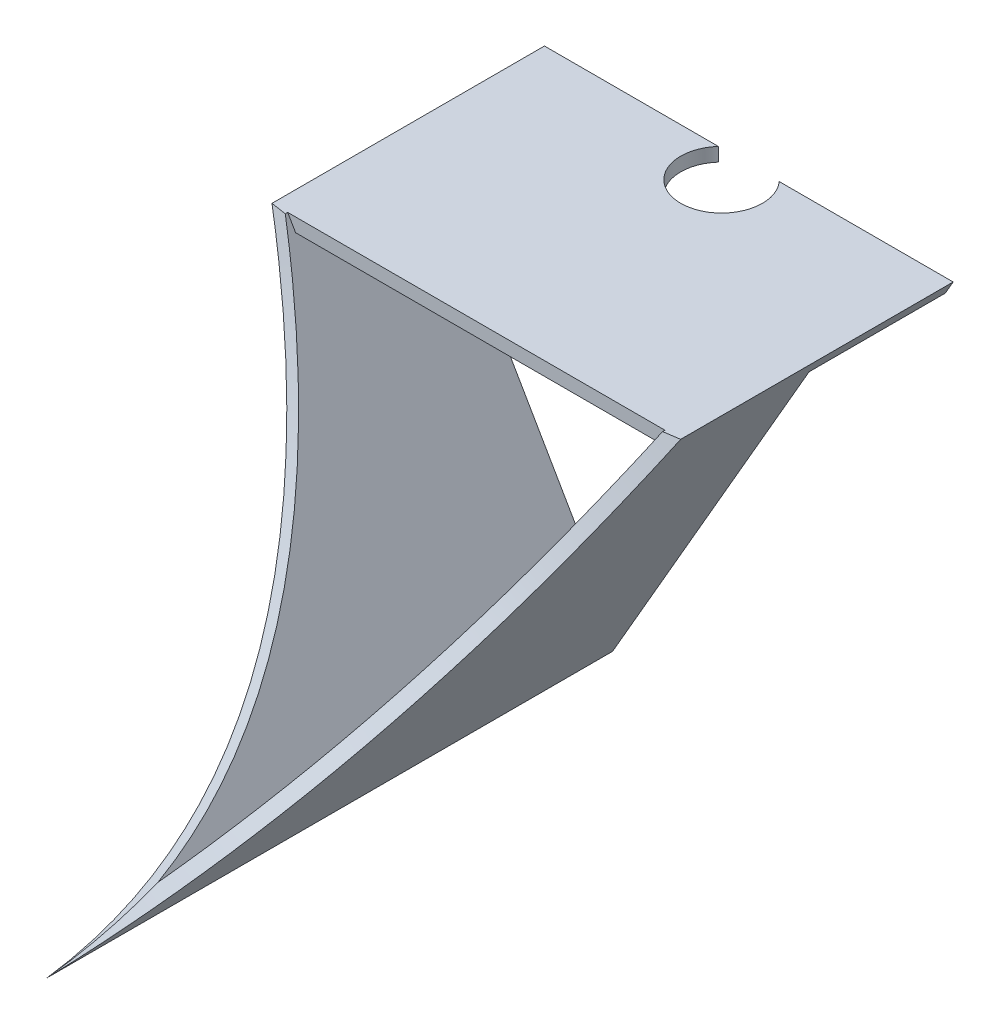
ISO-10303-21;
HEADER;
FILE_DESCRIPTION(('STEP AP214'),'2;1');
FILE_NAME('part.step','',(''),(''),'','','');
FILE_SCHEMA(('AUTOMOTIVE_DESIGN { 1 0 10303 214 1 1 1 1 }'));
ENDSEC;
DATA;
#1=APPLICATION_CONTEXT('core data for automotive mechanical design processes');
#2=APPLICATION_PROTOCOL_DEFINITION('international standard','automotive_design',2000,#1);
#3=PRODUCT_CONTEXT('',#1,'mechanical');
#4=PRODUCT('Part','Part','',(#3));
#5=PRODUCT_RELATED_PRODUCT_CATEGORY('part','',(#4));
#6=PRODUCT_DEFINITION_FORMATION('','',#4);
#7=PRODUCT_DEFINITION_CONTEXT('part definition',#1,'design');
#8=PRODUCT_DEFINITION('design','',#6,#7);
#9=PRODUCT_DEFINITION_SHAPE('','',#8);
#10=(LENGTH_UNIT() NAMED_UNIT(*) SI_UNIT(.MILLI.,.METRE.));
#11=(NAMED_UNIT(*) PLANE_ANGLE_UNIT() SI_UNIT($,.RADIAN.));
#12=(NAMED_UNIT(*) SI_UNIT($,.STERADIAN.) SOLID_ANGLE_UNIT());
#13=UNCERTAINTY_MEASURE_WITH_UNIT(LENGTH_MEASURE(1.E-05),#10,'distance_accuracy_value','');
#14=(GEOMETRIC_REPRESENTATION_CONTEXT(3) GLOBAL_UNCERTAINTY_ASSIGNED_CONTEXT((#13)) GLOBAL_UNIT_ASSIGNED_CONTEXT((#10,
#11,#12)) REPRESENTATION_CONTEXT('',''));
#15=CARTESIAN_POINT('',(0.,0.,0.));
#16=DIRECTION('',(0.,0.,1.));
#17=DIRECTION('',(1.,0.,0.));
#18=AXIS2_PLACEMENT_3D('',#15,#16,#17);
#19=CARTESIAN_POINT('',(0.,0.,0.));
#20=DIRECTION('',(0.,0.,-1.));
#21=DIRECTION('',(-1.,0.,0.));
#22=AXIS2_PLACEMENT_3D('',#19,#20,#21);
#23=PLANE('',#22);
#24=DIRECTION('',(0.,1.,0.));
#25=VECTOR('',#24,1.);
#26=CARTESIAN_POINT('',(-2.23606797749979,0.,0.));
#27=LINE('',#26,#25);
#28=CARTESIAN_POINT('',(-2.23606797749979,0.,0.));
#29=VERTEX_POINT('',#28);
#30=CARTESIAN_POINT('',(-2.23606797749979,1.,0.));
#31=VERTEX_POINT('',#30);
#32=EDGE_CURVE('E11',#29,#31,#27,.T.);
#33=ORIENTED_EDGE('',*,*,#32,.F.);
#34=DIRECTION('',(-1.,0.,0.));
#35=VECTOR('',#34,1.);
#36=CARTESIAN_POINT('',(-13.2679491924311,0.,0.));
#37=LINE('',#36,#35);
#38=CARTESIAN_POINT('',(-14.4226497308104,0.,0.));
#39=VERTEX_POINT('',#38);
#40=EDGE_CURVE('E173',#29,#39,#37,.T.);
#41=ORIENTED_EDGE('',*,*,#40,.T.);
#42=DIRECTION('',(0.500000000000004,-0.866025403784436,0.));
#43=VECTOR('',#42,1.);
#44=CARTESIAN_POINT('',(-15.,1.,0.));
#45=LINE('',#44,#43);
#46=CARTESIAN_POINT('',(-15.,1.,0.));
#47=VERTEX_POINT('',#46);
#48=EDGE_CURVE('E144',#47,#39,#45,.T.);
#49=ORIENTED_EDGE('',*,*,#48,.F.);
#50=DIRECTION('',(-1.,0.,0.));
#51=VECTOR('',#50,1.);
#52=CARTESIAN_POINT('',(-15.,1.,0.));
#53=LINE('',#52,#51);
#54=EDGE_CURVE('E135',#31,#47,#53,.T.);
#55=ORIENTED_EDGE('',*,*,#54,.F.);
#56=EDGE_LOOP('',(#33,#41,#49,#55));
#57=FACE_BOUND('',#56,.T.);
#58=ADVANCED_FACE('F38',(#57),#23,.T.);
#59=CARTESIAN_POINT('',(-13.2679491924311,0.,60.));
#60=DIRECTION('',(0.,-1.,0.));
#61=DIRECTION('',(0.,0.,-1.));
#62=AXIS2_PLACEMENT_3D('',#59,#60,#61);
#63=PLANE('',#62);
#64=CARTESIAN_POINT('',(0.,0.,2.));
#65=DIRECTION('',(0.,1.,0.));
#66=DIRECTION('',(-1.,0.,0.));
#67=AXIS2_PLACEMENT_3D('',#64,#65,#66);
#68=CIRCLE('',#67,3.);
#69=CARTESIAN_POINT('',(2.23606797749979,0.,0.));
#70=VERTEX_POINT('',#69);
#71=EDGE_CURVE('E127',#29,#70,#68,.T.);
#72=ORIENTED_EDGE('',*,*,#71,.T.);
#73=CARTESIAN_POINT('',(14.4226497308104,0.,0.));
#74=VERTEX_POINT('',#73);
#75=EDGE_CURVE('E170',#74,#70,#37,.T.);
#76=ORIENTED_EDGE('',*,*,#75,.F.);
#77=DIRECTION('',(0.,0.,-1.));
#78=VECTOR('',#77,1.);
#79=CARTESIAN_POINT('',(14.4226497308104,0.,60.));
#80=LINE('',#79,#78);
#81=CARTESIAN_POINT('',(14.4226497308104,0.,10.));
#82=VERTEX_POINT('',#81);
#83=EDGE_CURVE('E294',#82,#74,#80,.T.);
#84=ORIENTED_EDGE('',*,*,#83,.F.);
#85=DIRECTION('',(1.,0.,0.));
#86=VECTOR('',#85,1.);
#87=CARTESIAN_POINT('',(15.8721667836003,0.,10.));
#88=LINE('',#87,#86);
#89=CARTESIAN_POINT('',(13.2679491924311,0.,10.));
#90=VERTEX_POINT('',#89);
#91=EDGE_CURVE('E175',#90,#82,#88,.T.);
#92=ORIENTED_EDGE('',*,*,#91,.F.);
#93=DIRECTION('',(0.,0.,-1.));
#94=VECTOR('',#93,1.);
#95=CARTESIAN_POINT('',(13.2679491924311,0.,60.));
#96=LINE('',#95,#94);
#97=CARTESIAN_POINT('',(13.2679491972894,8.41483458434433E-09,20.));
#98=VERTEX_POINT('',#97);
#99=EDGE_CURVE('E200',#98,#90,#96,.T.);
#100=ORIENTED_EDGE('',*,*,#99,.F.);
#101=DIRECTION('',(1.,3.17111367191734E-10,0.));
#102=VECTOR('',#101,1.);
#103=CARTESIAN_POINT('',(13.2679491972894,8.41483458434433E-09,20.));
#104=LINE('',#103,#102);
#105=CARTESIAN_POINT('',(-13.2679491924311,0.,20.));
#106=VERTEX_POINT('',#105);
#107=EDGE_CURVE('E285',#106,#98,#104,.T.);
#108=ORIENTED_EDGE('',*,*,#107,.F.);
#109=DIRECTION('',(0.,0.,-1.));
#110=VECTOR('',#109,1.);
#111=CARTESIAN_POINT('',(-13.2679491924311,0.,60.));
#112=LINE('',#111,#110);
#113=CARTESIAN_POINT('',(-13.2679491924311,0.,10.));
#114=VERTEX_POINT('',#113);
#115=EDGE_CURVE('E185',#106,#114,#112,.T.);
#116=ORIENTED_EDGE('',*,*,#115,.T.);
#117=CARTESIAN_POINT('',(-14.4226497308104,0.,10.));
#118=VERTEX_POINT('',#117);
#119=EDGE_CURVE('E306',#118,#114,#88,.T.);
#120=ORIENTED_EDGE('',*,*,#119,.F.);
#121=DIRECTION('',(0.,0.,1.));
#122=VECTOR('',#121,1.);
#123=CARTESIAN_POINT('',(-14.4226497308104,0.,60.));
#124=LINE('',#123,#122);
#125=EDGE_CURVE('E207',#39,#118,#124,.T.);
#126=ORIENTED_EDGE('',*,*,#125,.F.);
#127=ORIENTED_EDGE('',*,*,#40,.F.);
#128=EDGE_LOOP('',(#72,#76,#84,#92,#100,#108,#116,#120,#126,#127));
#129=FACE_BOUND('',#128,.T.);
#130=ADVANCED_FACE('F169',(#129),#63,.T.);
#131=CARTESIAN_POINT('',(-15.,1.,60.));
#132=DIRECTION('',(0.866025403784436,0.500000000000004,0.));
#133=DIRECTION('',(-0.500000000000004,0.866025403784436,0.));
#134=AXIS2_PLACEMENT_3D('',#131,#132,#133);
#135=PLANE('',#134);
#136=ORIENTED_EDGE('',*,*,#48,.T.);
#137=ORIENTED_EDGE('',*,*,#125,.T.);
#138=DIRECTION('',(0.500000000000004,-0.866025403784436,0.));
#139=VECTOR('',#138,1.);
#140=CARTESIAN_POINT('',(-15.,1.,10.));
#141=LINE('',#140,#139);
#142=CARTESIAN_POINT('',(0.,-24.9807621135329,10.));
#143=VERTEX_POINT('',#142);
#144=EDGE_CURVE('E297',#118,#143,#141,.T.);
#145=ORIENTED_EDGE('',*,*,#144,.T.);
#146=DIRECTION('',(0.,0.,-1.));
#147=VECTOR('',#146,1.);
#148=CARTESIAN_POINT('',(0.,-24.9807621135329,60.));
#149=LINE('',#148,#147);
#150=CARTESIAN_POINT('',(0.,-24.9807621135329,51.5266934957561));
#151=VERTEX_POINT('',#150);
#152=EDGE_CURVE('E159',#151,#143,#149,.T.);
#153=ORIENTED_EDGE('',*,*,#152,.F.);
#154=CARTESIAN_POINT('',(0.,-24.9807621135329,60.));
#155=CARTESIAN_POINT('',(1.30334503884656,-27.2382219406079,29.8865382210596));
#156=CARTESIAN_POINT('',(-15.,1.,20.));
#157=B_SPLINE_CURVE_WITH_KNOTS('',2,(#154,#155,#156),.UNSPECIFIED.,.F.,.F.,(3,3),(0.,1.),.UNSPECIFIED.);
#158=CARTESIAN_POINT('',(-15.,1.,20.));
#159=VERTEX_POINT('',#158);
#160=EDGE_CURVE('E210',#151,#159,#157,.T.);
#161=ORIENTED_EDGE('',*,*,#160,.T.);
#162=DIRECTION('',(0.,0.,-1.));
#163=VECTOR('',#162,1.);
#164=CARTESIAN_POINT('',(-15.,1.,60.));
#165=LINE('',#164,#163);
#166=EDGE_CURVE('E150',#159,#47,#165,.T.);
#167=ORIENTED_EDGE('',*,*,#166,.T.);
#168=EDGE_LOOP('',(#136,#137,#145,#153,#161,#167));
#169=FACE_BOUND('',#168,.T.);
#170=ADVANCED_FACE('F40',(#169),#135,.F.);
#171=CARTESIAN_POINT('',(-15.,1.,60.));
#172=DIRECTION('',(0.,-1.,0.));
#173=DIRECTION('',(1.,0.,0.));
#174=AXIS2_PLACEMENT_3D('',#171,#172,#173);
#175=PLANE('',#174);
#176=CARTESIAN_POINT('',(15.,0.999999999999999,0.));
#177=VERTEX_POINT('',#176);
#178=CARTESIAN_POINT('',(2.23606797749979,1.,0.));
#179=VERTEX_POINT('',#178);
#180=EDGE_CURVE('E139',#177,#179,#53,.T.);
#181=ORIENTED_EDGE('',*,*,#180,.T.);
#182=CARTESIAN_POINT('',(0.,1.,2.));
#183=DIRECTION('',(0.,1.,0.));
#184=DIRECTION('',(-1.,0.,0.));
#185=AXIS2_PLACEMENT_3D('',#182,#183,#184);
#186=CIRCLE('',#185,3.);
#187=EDGE_CURVE('E53',#31,#179,#186,.T.);
#188=ORIENTED_EDGE('',*,*,#187,.F.);
#189=ORIENTED_EDGE('',*,*,#54,.T.);
#190=ORIENTED_EDGE('',*,*,#166,.F.);
#191=CARTESIAN_POINT('',(-13.8452994643103,1.00000000232923,20.1775016422521));
#192=CARTESIAN_POINT('',(-14.037688046205,1.00000000116461,20.147517911517));
#193=CARTESIAN_POINT('',(-14.2301073817931,1.0000000003882,20.1177342426284));
#194=CARTESIAN_POINT('',(-14.6150075603564,0.999999999611796,20.0585670285444));
#195=CARTESIAN_POINT('',(-14.8074884033315,0.999999999611797,20.0291834833489));
#196=CARTESIAN_POINT('',(-15.,1.,20.));
#197=B_SPLINE_CURVE_WITH_KNOTS('',3,(#191,#192,#193,#194,#195,#196),.UNSPECIFIED.,.F.,.F.,(4,2,
4),(0.,0.584132184326329,1.16826436865266),.UNSPECIFIED.);
#198=CARTESIAN_POINT('',(-13.8452994586593,0.999999994870652,20.1775016457751));
#199=VERTEX_POINT('',#198);
#200=EDGE_CURVE('E213',#199,#159,#197,.T.);
#201=ORIENTED_EDGE('',*,*,#200,.F.);
#202=DIRECTION('',(0.,0.,1.));
#203=VECTOR('',#202,1.);
#204=CARTESIAN_POINT('',(-13.8452994586593,0.999999994870652,20.));
#205=LINE('',#204,#203);
#206=CARTESIAN_POINT('',(-13.8452994586593,0.999999994870652,20.));
#207=VERTEX_POINT('',#206);
#208=EDGE_CURVE('E215',#207,#199,#205,.T.);
#209=ORIENTED_EDGE('',*,*,#208,.F.);
#210=DIRECTION('',(-1.,-1.85237866554277E-10,0.));
#211=VECTOR('',#210,1.);
#212=CARTESIAN_POINT('',(-13.8452994586593,0.999999994870652,20.));
#213=LINE('',#212,#211);
#214=CARTESIAN_POINT('',(13.8452994616207,1.,20.));
#215=VERTEX_POINT('',#214);
#216=EDGE_CURVE('E276',#215,#207,#213,.T.);
#217=ORIENTED_EDGE('',*,*,#216,.F.);
#218=DIRECTION('',(0.,0.,1.));
#219=VECTOR('',#218,1.);
#220=CARTESIAN_POINT('',(13.8452994616207,1.,20.));
#221=LINE('',#220,#219);
#222=CARTESIAN_POINT('',(13.8452994616207,1.,20.1775016457751));
#223=VERTEX_POINT('',#222);
#224=EDGE_CURVE('E261',#215,#223,#221,.T.);
#225=ORIENTED_EDGE('',*,*,#224,.T.);
#226=CARTESIAN_POINT('',(13.8452994643103,1.00000000232923,20.1775016422521));
#227=CARTESIAN_POINT('',(14.037688046205,1.00000000116461,20.147517911517));
#228=CARTESIAN_POINT('',(14.2301073817931,1.0000000003882,20.1177342426284));
#229=CARTESIAN_POINT('',(14.6150075603564,0.999999999611796,20.0585670285444));
#230=CARTESIAN_POINT('',(14.8074884033315,0.999999999611798,20.0291834833489));
#231=CARTESIAN_POINT('',(15.,1.,20.));
#232=B_SPLINE_CURVE_WITH_KNOTS('',3,(#226,#227,#228,#229,#230,#231),.UNSPECIFIED.,.F.,.F.,(4,2,
4),(0.,0.584132184326331,1.16826436865266),.UNSPECIFIED.);
#233=CARTESIAN_POINT('',(15.,1.,20.));
#234=VERTEX_POINT('',#233);
#235=EDGE_CURVE('E187',#223,#234,#232,.T.);
#236=ORIENTED_EDGE('',*,*,#235,.T.);
#237=DIRECTION('',(0.,0.,-1.));
#238=VECTOR('',#237,1.);
#239=CARTESIAN_POINT('',(15.,0.999999999999999,60.));
#240=LINE('',#239,#238);
#241=EDGE_CURVE('E156',#234,#177,#240,.T.);
#242=ORIENTED_EDGE('',*,*,#241,.T.);
#243=EDGE_LOOP('',(#181,#188,#189,#190,#201,#209,#217,#225,#236,#242));
#244=FACE_BOUND('',#243,.T.);
#245=ADVANCED_FACE('F133',(#244),#175,.F.);
#246=CARTESIAN_POINT('',(-13.2679491924311,0.,60.));
#247=DIRECTION('',(0.866025403784436,0.500000000000004,0.));
#248=DIRECTION('',(-0.500000000000004,0.866025403784436,0.));
#249=AXIS2_PLACEMENT_3D('',#246,#247,#248);
#250=PLANE('',#249);
#251=DIRECTION('',(0.500000000000004,-0.866025403784436,0.));
#252=VECTOR('',#251,1.);
#253=CARTESIAN_POINT('',(-13.2679491924311,0.,10.));
#254=LINE('',#253,#252);
#255=CARTESIAN_POINT('',(0.,-22.9807621135329,10.));
#256=VERTEX_POINT('',#255);
#257=EDGE_CURVE('E61',#114,#256,#254,.T.);
#258=ORIENTED_EDGE('',*,*,#257,.F.);
#259=ORIENTED_EDGE('',*,*,#115,.F.);
#260=DIRECTION('',(0.500000000000005,-0.866025403784436,0.));
#261=VECTOR('',#260,1.);
#262=CARTESIAN_POINT('',(-13.2679491924311,0.,20.));
#263=LINE('',#262,#261);
#264=EDGE_CURVE('E289',#207,#106,#263,.T.);
#265=ORIENTED_EDGE('',*,*,#264,.F.);
#266=ORIENTED_EDGE('',*,*,#208,.T.);
#267=CARTESIAN_POINT('',(0.86602540378444,-24.4807621135329,60.));
#268=CARTESIAN_POINT('',(2.169370442631,-26.7382219406079,29.8865382210596));
#269=CARTESIAN_POINT('',(-14.1339745962156,1.5,20.));
#270=B_SPLINE_CURVE_WITH_KNOTS('',2,(#267,#268,#269),.UNSPECIFIED.,.F.,.F.,(3,3),(0.,1.),.UNSPECIFIED.);
#271=CARTESIAN_POINT('',(7.60806348476528E-12,-22.9807621135461,43.3767741457255));
#272=VERTEX_POINT('',#271);
#273=EDGE_CURVE('E226',#272,#199,#270,.T.);
#274=ORIENTED_EDGE('',*,*,#273,.F.);
#275=DIRECTION('',(0.,0.,-1.));
#276=VECTOR('',#275,1.);
#277=CARTESIAN_POINT('',(0.,-22.9807621135329,60.));
#278=LINE('',#277,#276);
#279=EDGE_CURVE('E180',#272,#256,#278,.T.);
#280=ORIENTED_EDGE('',*,*,#279,.T.);
#281=EDGE_LOOP('',(#258,#259,#265,#266,#274,#280));
#282=FACE_BOUND('',#281,.T.);
#283=ADVANCED_FACE('F314',(#282),#250,.T.);
#284=CARTESIAN_POINT('',(-0.86602540378444,-24.4807621135329,60.));
#285=CARTESIAN_POINT('',(-2.169370442631,-26.7382219406079,29.8865382210596));
#286=CARTESIAN_POINT('',(14.1339745962156,1.5,20.));
#287=B_SPLINE_CURVE_WITH_KNOTS('',2,(#284,#285,#286),.UNSPECIFIED.,.F.,.F.,(3,3),(0.,1.),.UNSPECIFIED.);
#288=DIRECTION('',(0.866025403784436,-0.500000000000004,0.));
#289=VECTOR('',#288,1.);
#290=SURFACE_OF_LINEAR_EXTRUSION('',#287,#289);
#291=CARTESIAN_POINT('',(0.,-24.9807621135329,51.5266934957563));
#292=CARTESIAN_POINT('',(0.,-24.9548568112254,51.2932857542788));
#293=CARTESIAN_POINT('',(0.,-24.9265948454539,51.060137278982));
#294=CARTESIAN_POINT('',(0.,-24.8653430323396,50.5950253020613));
#295=CARTESIAN_POINT('',(0.,-24.8323645609736,50.3630603014234));
#296=CARTESIAN_POINT('',(0.,-24.7616123036165,49.9003259772489));
#297=CARTESIAN_POINT('',(0.,-24.7238480204877,49.6695552026239));
#298=CARTESIAN_POINT('',(0.,-24.6434562605056,49.2092218247318));
#299=CARTESIAN_POINT('',(0.,-24.6008362350922,48.9796579210605));
#300=CARTESIAN_POINT('',(0.,-24.5106627546688,48.5217506366921));
#301=CARTESIAN_POINT('',(0.,-24.463114523207,48.2934062280607));
#302=CARTESIAN_POINT('',(0.,-24.3630124369588,47.8379506625689));
#303=CARTESIAN_POINT('',(0.,-24.3104614002332,47.6108388866961));
#304=CARTESIAN_POINT('',(0.,-24.2002644944753,47.157800614679));
#305=CARTESIAN_POINT('',(0.,-24.1426174946987,46.9318743934383));
#306=CARTESIAN_POINT('',(0.,-24.0221666525796,46.4812917797409));
#307=CARTESIAN_POINT('',(0.,-23.9593605113032,46.2566360015805));
#308=CARTESIAN_POINT('',(0.,-23.8285160425329,45.8086183056261));
#309=CARTESIAN_POINT('',(0.,-23.7604727421159,45.5852578396499));
#310=CARTESIAN_POINT('',(0.,-23.6190774753951,45.1398550904536));
#311=CARTESIAN_POINT('',(0.,-23.5457177165855,44.9178152802958));
#312=CARTESIAN_POINT('',(0.,-23.3936107201638,44.4750785762086));
#313=CARTESIAN_POINT('',(0.,-23.3148527347881,44.2543853735757));
#314=CARTESIAN_POINT('',(0.,-23.1518723603388,43.8143665697912));
#315=CARTESIAN_POINT('',(0.,-23.0676361566611,43.5950460859297));
#316=CARTESIAN_POINT('',(0.,-22.9807621135339,43.376774145684));
#317=B_SPLINE_CURVE_WITH_KNOTS('',3,(#291,#292,#293,#294,#295,#296,#297,#298,#299,#300,#301,
#302,#303,#304,#305,#306,#307,#308,#309,#310,#311,#312,#313,#314,#315,#316),.UNSPECIFIED.,.F.,
.F.,(4,2,2,2,2,2,2,2,2,2,2,2,4),(0.,0.704514151410825,1.4073568432882,2.10882519544079,
2.80923124245512,3.5089023569578,4.20818165554366,4.90761650870112,5.60736474133455,
6.30778581463949,7.00925513272043,7.71216408006146,8.41692000547265),.UNSPECIFIED.);
#318=EDGE_CURVE('E220',#151,#272,#317,.T.);
#319=ORIENTED_EDGE('',*,*,#318,.F.);
#320=CARTESIAN_POINT('',(0.,-24.9807621135329,60.));
#321=CARTESIAN_POINT('',(-1.30334503884656,-27.2382219406079,29.8865382210596));
#322=CARTESIAN_POINT('',(15.,1.,20.));
#323=B_SPLINE_CURVE_WITH_KNOTS('',2,(#320,#321,#322),.UNSPECIFIED.,.F.,.F.,(3,3),(0.,1.),.UNSPECIFIED.);
#324=EDGE_CURVE('E219',#151,#234,#323,.T.);
#325=ORIENTED_EDGE('',*,*,#324,.T.);
#326=ORIENTED_EDGE('',*,*,#235,.F.);
#327=EDGE_CURVE('E224',#272,#223,#287,.T.);
#328=ORIENTED_EDGE('',*,*,#327,.F.);
#329=EDGE_LOOP('',(#319,#325,#326,#328));
#330=FACE_BOUND('',#329,.T.);
#331=ADVANCED_FACE('F252',(#330),#290,.F.);
#332=DIRECTION('',(0.,1.,0.));
#333=VECTOR('',#332,1.);
#334=CARTESIAN_POINT('',(2.23606797749979,0.,0.));
#335=LINE('',#334,#333);
#336=EDGE_CURVE('E47',#179,#70,#335,.F.);
#337=ORIENTED_EDGE('',*,*,#336,.F.);
#338=ORIENTED_EDGE('',*,*,#180,.F.);
#339=DIRECTION('',(0.500000000000004,0.866025403784436,0.));
#340=VECTOR('',#339,1.);
#341=CARTESIAN_POINT('',(15.,0.999999999999999,0.));
#342=LINE('',#341,#340);
#343=EDGE_CURVE('E146',#74,#177,#342,.T.);
#344=ORIENTED_EDGE('',*,*,#343,.F.);
#345=ORIENTED_EDGE('',*,*,#75,.T.);
#346=EDGE_LOOP('',(#337,#338,#344,#345));
#347=FACE_BOUND('',#346,.T.);
#348=ADVANCED_FACE('F178',(#347),#23,.T.);
#349=CARTESIAN_POINT('',(15.,0.999999999999999,60.));
#350=DIRECTION('',(-0.866025403784436,0.500000000000004,0.));
#351=DIRECTION('',(-0.500000000000004,-0.866025403784436,0.));
#352=AXIS2_PLACEMENT_3D('',#349,#350,#351);
#353=PLANE('',#352);
#354=DIRECTION('',(0.500000000000004,0.866025403784436,0.));
#355=VECTOR('',#354,1.);
#356=CARTESIAN_POINT('',(15.,0.999999999999999,10.));
#357=LINE('',#356,#355);
#358=EDGE_CURVE('E300',#143,#82,#357,.T.);
#359=ORIENTED_EDGE('',*,*,#358,.T.);
#360=ORIENTED_EDGE('',*,*,#83,.T.);
#361=ORIENTED_EDGE('',*,*,#343,.T.);
#362=ORIENTED_EDGE('',*,*,#241,.F.);
#363=ORIENTED_EDGE('',*,*,#324,.F.);
#364=ORIENTED_EDGE('',*,*,#152,.T.);
#365=EDGE_LOOP('',(#359,#360,#361,#362,#363,#364));
#366=FACE_BOUND('',#365,.T.);
#367=ADVANCED_FACE('F330',(#366),#353,.F.);
#368=CARTESIAN_POINT('',(13.2679491924311,0.,60.));
#369=DIRECTION('',(-0.866025403784436,0.500000000000004,0.));
#370=DIRECTION('',(-0.500000000000004,-0.866025403784436,0.));
#371=AXIS2_PLACEMENT_3D('',#368,#369,#370);
#372=PLANE('',#371);
#373=DIRECTION('',(0.500000000000004,0.866025403784436,0.));
#374=VECTOR('',#373,1.);
#375=CARTESIAN_POINT('',(13.2679491924311,0.,10.));
#376=LINE('',#375,#374);
#377=EDGE_CURVE('E163',#256,#90,#376,.T.);
#378=ORIENTED_EDGE('',*,*,#377,.F.);
#379=ORIENTED_EDGE('',*,*,#279,.F.);
#380=ORIENTED_EDGE('',*,*,#327,.T.);
#381=ORIENTED_EDGE('',*,*,#224,.F.);
#382=DIRECTION('',(0.500000000000004,0.866025403784436,0.));
#383=VECTOR('',#382,1.);
#384=CARTESIAN_POINT('',(13.8452994616207,1.,20.));
#385=LINE('',#384,#383);
#386=EDGE_CURVE('E281',#98,#215,#385,.T.);
#387=ORIENTED_EDGE('',*,*,#386,.F.);
#388=ORIENTED_EDGE('',*,*,#99,.T.);
#389=EDGE_LOOP('',(#378,#379,#380,#381,#387,#388));
#390=FACE_BOUND('',#389,.T.);
#391=ADVANCED_FACE('F250',(#390),#372,.T.);
#392=DIRECTION('',(-0.866025403784436,-0.500000000000004,0.));
#393=VECTOR('',#392,1.);
#394=SURFACE_OF_LINEAR_EXTRUSION('',#270,#393);
#395=ORIENTED_EDGE('',*,*,#200,.T.);
#396=ORIENTED_EDGE('',*,*,#160,.F.);
#397=ORIENTED_EDGE('',*,*,#318,.T.);
#398=ORIENTED_EDGE('',*,*,#273,.T.);
#399=EDGE_LOOP('',(#395,#396,#397,#398));
#400=FACE_BOUND('',#399,.T.);
#401=ADVANCED_FACE('F244',(#400),#394,.T.);
#402=CARTESIAN_POINT('',(0.,0.,20.));
#403=DIRECTION('',(0.,0.,1.));
#404=DIRECTION('',(1.,0.,0.));
#405=AXIS2_PLACEMENT_3D('',#402,#403,#404);
#406=PLANE('',#405);
#407=ORIENTED_EDGE('',*,*,#264,.T.);
#408=ORIENTED_EDGE('',*,*,#107,.T.);
#409=ORIENTED_EDGE('',*,*,#386,.T.);
#410=ORIENTED_EDGE('',*,*,#216,.T.);
#411=EDGE_LOOP('',(#407,#408,#409,#410));
#412=FACE_BOUND('',#411,.T.);
#413=ADVANCED_FACE('F249',(#412),#406,.T.);
#414=CARTESIAN_POINT('',(0.,0.,10.));
#415=DIRECTION('',(0.,0.,1.));
#416=DIRECTION('',(1.,0.,0.));
#417=AXIS2_PLACEMENT_3D('',#414,#415,#416);
#418=PLANE('',#417);
#419=ORIENTED_EDGE('',*,*,#119,.T.);
#420=ORIENTED_EDGE('',*,*,#257,.T.);
#421=ORIENTED_EDGE('',*,*,#377,.T.);
#422=ORIENTED_EDGE('',*,*,#91,.T.);
#423=ORIENTED_EDGE('',*,*,#358,.F.);
#424=ORIENTED_EDGE('',*,*,#144,.F.);
#425=EDGE_LOOP('',(#419,#420,#421,#422,#423,#424));
#426=FACE_BOUND('',#425,.T.);
#427=ADVANCED_FACE('F312',(#426),#418,.F.);
#428=CARTESIAN_POINT('',(0.,0.,2.));
#429=DIRECTION('',(0.,1.,0.));
#430=DIRECTION('',(-1.,0.,0.));
#431=AXIS2_PLACEMENT_3D('',#428,#429,#430);
#432=CYLINDRICAL_SURFACE('',#431,3.);
#433=ORIENTED_EDGE('',*,*,#32,.T.);
#434=ORIENTED_EDGE('',*,*,#187,.T.);
#435=ORIENTED_EDGE('',*,*,#336,.T.);
#436=ORIENTED_EDGE('',*,*,#71,.F.);
#437=EDGE_LOOP('',(#433,#434,#435,#436));
#438=FACE_BOUND('',#437,.T.);
#439=ADVANCED_FACE('F125',(#438),#432,.F.);
#440=CLOSED_SHELL('',(#58,#130,#170,#245,#283,#331,#348,#367,#391,#401,#413,#427,#439));
#441=MANIFOLD_SOLID_BREP('B2',#440);
#442=ADVANCED_BREP_SHAPE_REPRESENTATION('',(#18,#441),#14);
#443=SHAPE_DEFINITION_REPRESENTATION(#9,#442);
ENDSEC;
END-ISO-10303-21;
